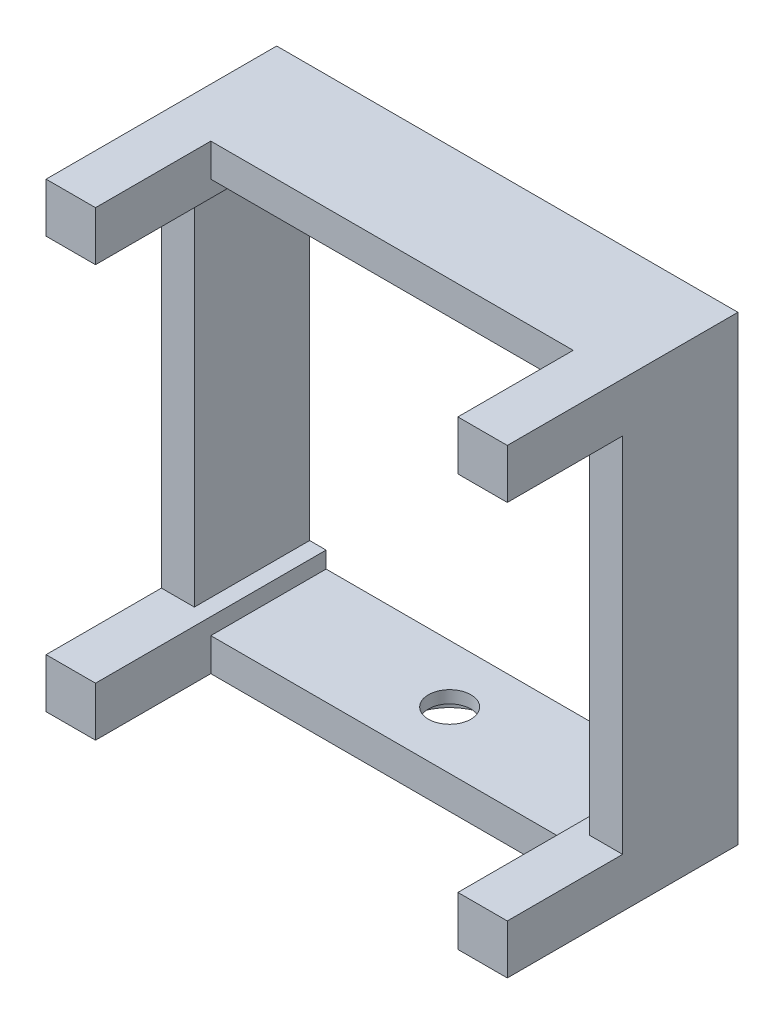
ISO-10303-21;
HEADER;
FILE_DESCRIPTION(('STEP AP214'),'2;1');
FILE_NAME('part.step','',(''),(''),'','','');
FILE_SCHEMA(('AUTOMOTIVE_DESIGN { 1 0 10303 214 1 1 1 1 }'));
ENDSEC;
DATA;
#1=APPLICATION_CONTEXT('core data for automotive mechanical design processes');
#2=APPLICATION_PROTOCOL_DEFINITION('international standard','automotive_design',2000,#1);
#3=PRODUCT_CONTEXT('',#1,'mechanical');
#4=PRODUCT('Part','Part','',(#3));
#5=PRODUCT_RELATED_PRODUCT_CATEGORY('part','',(#4));
#6=PRODUCT_DEFINITION_FORMATION('','',#4);
#7=PRODUCT_DEFINITION_CONTEXT('part definition',#1,'design');
#8=PRODUCT_DEFINITION('design','',#6,#7);
#9=PRODUCT_DEFINITION_SHAPE('','',#8);
#10=(LENGTH_UNIT() NAMED_UNIT(*) SI_UNIT(.MILLI.,.METRE.));
#11=(NAMED_UNIT(*) PLANE_ANGLE_UNIT() SI_UNIT($,.RADIAN.));
#12=(NAMED_UNIT(*) SI_UNIT($,.STERADIAN.) SOLID_ANGLE_UNIT());
#13=UNCERTAINTY_MEASURE_WITH_UNIT(LENGTH_MEASURE(1.E-05),#10,'distance_accuracy_value','');
#14=(GEOMETRIC_REPRESENTATION_CONTEXT(3) GLOBAL_UNCERTAINTY_ASSIGNED_CONTEXT((#13)) GLOBAL_UNIT_ASSIGNED_CONTEXT((#10,
#11,#12)) REPRESENTATION_CONTEXT('',''));
#15=CARTESIAN_POINT('',(0.,0.,0.));
#16=DIRECTION('',(0.,0.,1.));
#17=DIRECTION('',(1.,0.,0.));
#18=AXIS2_PLACEMENT_3D('',#15,#16,#17);
#19=CARTESIAN_POINT('',(0.,0.,0.));
#20=DIRECTION('',(0.,0.,1.));
#21=DIRECTION('',(1.,0.,0.));
#22=AXIS2_PLACEMENT_3D('',#19,#20,#21);
#23=PLANE('',#22);
#24=DIRECTION('',(1.,0.,0.));
#25=VECTOR('',#24,1.);
#26=CARTESIAN_POINT('',(0.,76.5,0.));
#27=LINE('',#26,#25);
#28=CARTESIAN_POINT('',(80.5,76.5,0.));
#29=VERTEX_POINT('',#28);
#30=CARTESIAN_POINT('',(88.5,76.5,0.));
#31=VERTEX_POINT('',#30);
#32=EDGE_CURVE('E11',#29,#31,#27,.T.);
#33=ORIENTED_EDGE('',*,*,#32,.F.);
#34=DIRECTION('',(0.,1.,0.));
#35=VECTOR('',#34,1.);
#36=CARTESIAN_POINT('',(80.5,0.,0.));
#37=LINE('',#36,#35);
#38=CARTESIAN_POINT('',(80.5,-11.5,0.));
#39=VERTEX_POINT('',#38);
#40=EDGE_CURVE('E345',#39,#29,#37,.T.);
#41=ORIENTED_EDGE('',*,*,#40,.F.);
#42=DIRECTION('',(-1.,0.,0.));
#43=VECTOR('',#42,1.);
#44=CARTESIAN_POINT('',(0.,-11.5,0.));
#45=LINE('',#44,#43);
#46=CARTESIAN_POINT('',(88.5,-11.5,0.));
#47=VERTEX_POINT('',#46);
#48=EDGE_CURVE('E393',#47,#39,#45,.T.);
#49=ORIENTED_EDGE('',*,*,#48,.F.);
#50=DIRECTION('',(0.,1.,0.));
#51=VECTOR('',#50,1.);
#52=CARTESIAN_POINT('',(88.5,0.,0.));
#53=LINE('',#52,#51);
#54=EDGE_CURVE('E362',#47,#31,#53,.T.);
#55=ORIENTED_EDGE('',*,*,#54,.T.);
#56=EDGE_LOOP('',(#33,#41,#49,#55));
#57=FACE_BOUND('',#56,.T.);
#58=ADVANCED_FACE('F33',(#57),#23,.T.);
#59=DIRECTION('',(0.,-1.,0.));
#60=VECTOR('',#59,1.);
#61=CARTESIAN_POINT('',(76.5,0.,0.));
#62=LINE('',#61,#60);
#63=CARTESIAN_POINT('',(76.5,-15.5,0.));
#64=VERTEX_POINT('',#63);
#65=CARTESIAN_POINT('',(76.5,-23.5,0.));
#66=VERTEX_POINT('',#65);
#67=EDGE_CURVE('E396',#64,#66,#62,.T.);
#68=ORIENTED_EDGE('',*,*,#67,.F.);
#69=DIRECTION('',(1.,0.,0.));
#70=VECTOR('',#69,1.);
#71=CARTESIAN_POINT('',(0.,-15.5,0.));
#72=LINE('',#71,#70);
#73=CARTESIAN_POINT('',(-11.5,-15.5,0.));
#74=VERTEX_POINT('',#73);
#75=EDGE_CURVE('E367',#74,#64,#72,.T.);
#76=ORIENTED_EDGE('',*,*,#75,.F.);
#77=DIRECTION('',(0.,1.,0.));
#78=VECTOR('',#77,1.);
#79=CARTESIAN_POINT('',(-11.5,0.,0.));
#80=LINE('',#79,#78);
#81=CARTESIAN_POINT('',(-11.5,-23.5,0.));
#82=VERTEX_POINT('',#81);
#83=EDGE_CURVE('E387',#82,#74,#80,.T.);
#84=ORIENTED_EDGE('',*,*,#83,.F.);
#85=DIRECTION('',(1.,0.,0.));
#86=VECTOR('',#85,1.);
#87=CARTESIAN_POINT('',(0.,-23.5,0.));
#88=LINE('',#87,#86);
#89=EDGE_CURVE('E360',#82,#66,#88,.T.);
#90=ORIENTED_EDGE('',*,*,#89,.T.);
#91=EDGE_LOOP('',(#68,#76,#84,#90));
#92=FACE_BOUND('',#91,.T.);
#93=ADVANCED_FACE('F482',(#92),#23,.T.);
#94=DIRECTION('',(-1.,0.,0.));
#95=VECTOR('',#94,1.);
#96=CARTESIAN_POINT('',(0.,-11.5,0.));
#97=LINE('',#96,#95);
#98=CARTESIAN_POINT('',(-15.5,-11.5,0.));
#99=VERTEX_POINT('',#98);
#100=CARTESIAN_POINT('',(-23.5,-11.5,0.));
#101=VERTEX_POINT('',#100);
#102=EDGE_CURVE('E390',#99,#101,#97,.T.);
#103=ORIENTED_EDGE('',*,*,#102,.F.);
#104=DIRECTION('',(0.,1.,0.));
#105=VECTOR('',#104,1.);
#106=CARTESIAN_POINT('',(-15.5,0.,0.));
#107=LINE('',#106,#105);
#108=CARTESIAN_POINT('',(-15.5,76.5,0.));
#109=VERTEX_POINT('',#108);
#110=EDGE_CURVE('E369',#99,#109,#107,.T.);
#111=ORIENTED_EDGE('',*,*,#110,.T.);
#112=DIRECTION('',(1.,0.,0.));
#113=VECTOR('',#112,1.);
#114=CARTESIAN_POINT('',(0.,76.5,0.));
#115=LINE('',#114,#113);
#116=CARTESIAN_POINT('',(-23.5,76.5,0.));
#117=VERTEX_POINT('',#116);
#118=EDGE_CURVE('E376',#117,#109,#115,.T.);
#119=ORIENTED_EDGE('',*,*,#118,.F.);
#120=DIRECTION('',(0.,1.,0.));
#121=VECTOR('',#120,1.);
#122=CARTESIAN_POINT('',(-23.5,0.,0.));
#123=LINE('',#122,#121);
#124=EDGE_CURVE('E341',#101,#117,#123,.T.);
#125=ORIENTED_EDGE('',*,*,#124,.F.);
#126=EDGE_LOOP('',(#103,#111,#119,#125));
#127=FACE_BOUND('',#126,.T.);
#128=ADVANCED_FACE('F469',(#127),#23,.T.);
#129=CARTESIAN_POINT('',(32.5,-15.5,-14.));
#130=DIRECTION('',(0.,-1.,0.));
#131=DIRECTION('',(0.,0.,-1.));
#132=AXIS2_PLACEMENT_3D('',#129,#130,#131);
#133=CYLINDRICAL_SURFACE('',#132,5.155);
#134=CARTESIAN_POINT('',(32.5,-15.5,-14.));
#135=DIRECTION('',(0.,-1.,0.));
#136=DIRECTION('',(0.,0.,-1.));
#137=AXIS2_PLACEMENT_3D('',#134,#135,#136);
#138=CIRCLE('',#137,5.155);
#139=CARTESIAN_POINT('',(32.5,-15.5,-19.155));
#140=VERTEX_POINT('',#139);
#141=EDGE_CURVE('E338',#140,#140,#138,.T.);
#142=ORIENTED_EDGE('',*,*,#141,.F.);
#143=EDGE_LOOP('',(#142));
#144=FACE_BOUND('',#143,.T.);
#145=CARTESIAN_POINT('',(32.5,-18.5,-14.));
#146=DIRECTION('',(0.,-1.,0.));
#147=DIRECTION('',(0.,0.,-1.));
#148=AXIS2_PLACEMENT_3D('',#145,#146,#147);
#149=CIRCLE('',#148,5.155);
#150=CARTESIAN_POINT('',(32.5,-18.5,-19.155));
#151=VERTEX_POINT('',#150);
#152=EDGE_CURVE('E335',#151,#151,#149,.F.);
#153=ORIENTED_EDGE('',*,*,#152,.F.);
#154=EDGE_LOOP('',(#153));
#155=FACE_BOUND('',#154,.T.);
#156=ADVANCED_FACE('F515',(#144,#155),#133,.F.);
#157=CARTESIAN_POINT('',(0.,-15.5,-28.));
#158=DIRECTION('',(0.,-1.,0.));
#159=DIRECTION('',(0.,0.,-1.));
#160=AXIS2_PLACEMENT_3D('',#157,#158,#159);
#161=PLANE('',#160);
#162=ORIENTED_EDGE('',*,*,#141,.T.);
#163=EDGE_LOOP('',(#162));
#164=FACE_BOUND('',#163,.T.);
#165=ORIENTED_EDGE('',*,*,#75,.T.);
#166=DIRECTION('',(0.,0.,-1.));
#167=VECTOR('',#166,1.);
#168=CARTESIAN_POINT('',(76.5,-15.5,-28.));
#169=LINE('',#168,#167);
#170=CARTESIAN_POINT('',(76.5,-15.5,-28.));
#171=VERTEX_POINT('',#170);
#172=EDGE_CURVE('E56',#64,#171,#169,.T.);
#173=ORIENTED_EDGE('',*,*,#172,.T.);
#174=DIRECTION('',(1.,0.,0.));
#175=VECTOR('',#174,1.);
#176=CARTESIAN_POINT('',(0.,-15.5,-28.));
#177=LINE('',#176,#175);
#178=CARTESIAN_POINT('',(-11.5,-15.5,-28.));
#179=VERTEX_POINT('',#178);
#180=EDGE_CURVE('E350',#179,#171,#177,.T.);
#181=ORIENTED_EDGE('',*,*,#180,.F.);
#182=DIRECTION('',(0.,0.,1.));
#183=VECTOR('',#182,1.);
#184=CARTESIAN_POINT('',(-11.5,-15.5,-28.));
#185=LINE('',#184,#183);
#186=EDGE_CURVE('E288',#179,#74,#185,.T.);
#187=ORIENTED_EDGE('',*,*,#186,.T.);
#188=EDGE_LOOP('',(#165,#173,#181,#187));
#189=FACE_BOUND('',#188,.T.);
#190=ADVANCED_FACE('F480',(#164,#189),#161,.F.);
#191=CARTESIAN_POINT('',(80.5,0.,-28.));
#192=DIRECTION('',(1.,0.,0.));
#193=DIRECTION('',(0.,0.,-1.));
#194=AXIS2_PLACEMENT_3D('',#191,#192,#193);
#195=PLANE('',#194);
#196=ORIENTED_EDGE('',*,*,#40,.T.);
#197=DIRECTION('',(0.,0.,-1.));
#198=VECTOR('',#197,1.);
#199=CARTESIAN_POINT('',(80.5,76.5,-28.));
#200=LINE('',#199,#198);
#201=CARTESIAN_POINT('',(80.5,76.5,-28.));
#202=VERTEX_POINT('',#201);
#203=EDGE_CURVE('E240',#29,#202,#200,.T.);
#204=ORIENTED_EDGE('',*,*,#203,.T.);
#205=DIRECTION('',(0.,1.,0.));
#206=VECTOR('',#205,1.);
#207=CARTESIAN_POINT('',(80.5,0.,-28.));
#208=LINE('',#207,#206);
#209=CARTESIAN_POINT('',(80.5,-11.5,-28.));
#210=VERTEX_POINT('',#209);
#211=EDGE_CURVE('E48',#210,#202,#208,.T.);
#212=ORIENTED_EDGE('',*,*,#211,.F.);
#213=DIRECTION('',(0.,0.,1.));
#214=VECTOR('',#213,1.);
#215=CARTESIAN_POINT('',(80.5,-11.5,-28.));
#216=LINE('',#215,#214);
#217=EDGE_CURVE('E262',#210,#39,#216,.T.);
#218=ORIENTED_EDGE('',*,*,#217,.T.);
#219=EDGE_LOOP('',(#196,#204,#212,#218));
#220=FACE_BOUND('',#219,.T.);
#221=ADVANCED_FACE('F524',(#220),#195,.F.);
#222=CARTESIAN_POINT('',(0.,80.5,-28.));
#223=DIRECTION('',(0.,-1.,0.));
#224=DIRECTION('',(0.,0.,-1.));
#225=AXIS2_PLACEMENT_3D('',#222,#223,#224);
#226=PLANE('',#225);
#227=DIRECTION('',(0.,0.,-1.));
#228=VECTOR('',#227,1.);
#229=CARTESIAN_POINT('',(76.5,80.5,-28.));
#230=LINE('',#229,#228);
#231=CARTESIAN_POINT('',(76.5,80.5,0.));
#232=VERTEX_POINT('',#231);
#233=CARTESIAN_POINT('',(76.5,80.5,-28.));
#234=VERTEX_POINT('',#233);
#235=EDGE_CURVE('E235',#232,#234,#230,.T.);
#236=ORIENTED_EDGE('',*,*,#235,.F.);
#237=DIRECTION('',(1.,0.,0.));
#238=VECTOR('',#237,1.);
#239=CARTESIAN_POINT('',(0.,80.5,0.));
#240=LINE('',#239,#238);
#241=CARTESIAN_POINT('',(-11.5,80.5,0.));
#242=VERTEX_POINT('',#241);
#243=EDGE_CURVE('E371',#242,#232,#240,.T.);
#244=ORIENTED_EDGE('',*,*,#243,.F.);
#245=DIRECTION('',(0.,0.,1.));
#246=VECTOR('',#245,1.);
#247=CARTESIAN_POINT('',(-11.5,80.5,-28.));
#248=LINE('',#247,#246);
#249=CARTESIAN_POINT('',(-11.5,80.5,-28.));
#250=VERTEX_POINT('',#249);
#251=EDGE_CURVE('E322',#250,#242,#248,.T.);
#252=ORIENTED_EDGE('',*,*,#251,.F.);
#253=DIRECTION('',(1.,0.,0.));
#254=VECTOR('',#253,1.);
#255=CARTESIAN_POINT('',(0.,80.5,-28.));
#256=LINE('',#255,#254);
#257=EDGE_CURVE('E354',#250,#234,#256,.T.);
#258=ORIENTED_EDGE('',*,*,#257,.T.);
#259=EDGE_LOOP('',(#236,#244,#252,#258));
#260=FACE_BOUND('',#259,.T.);
#261=CARTESIAN_POINT('',(32.5,80.5,-14.));
#262=DIRECTION('',(0.,-1.,0.));
#263=DIRECTION('',(0.,0.,-1.));
#264=AXIS2_PLACEMENT_3D('',#261,#262,#263);
#265=CIRCLE('',#264,6.5);
#266=CARTESIAN_POINT('',(32.5,80.5,-20.5));
#267=VERTEX_POINT('',#266);
#268=EDGE_CURVE('E325',#267,#267,#265,.T.);
#269=ORIENTED_EDGE('',*,*,#268,.F.);
#270=EDGE_LOOP('',(#269));
#271=FACE_BOUND('',#270,.T.);
#272=ADVANCED_FACE('F406',(#260,#271),#226,.T.);
#273=CARTESIAN_POINT('',(-23.5,0.,-28.));
#274=DIRECTION('',(1.,0.,0.));
#275=DIRECTION('',(0.,0.,-1.));
#276=AXIS2_PLACEMENT_3D('',#273,#274,#275);
#277=PLANE('',#276);
#278=DIRECTION('',(0.,0.,1.));
#279=VECTOR('',#278,1.);
#280=CARTESIAN_POINT('',(-23.5,88.5,-28.));
#281=LINE('',#280,#279);
#282=CARTESIAN_POINT('',(-23.5,88.5,-28.));
#283=VERTEX_POINT('',#282);
#284=CARTESIAN_POINT('',(-23.5,88.5,28.));
#285=VERTEX_POINT('',#284);
#286=EDGE_CURVE('E208',#283,#285,#281,.T.);
#287=ORIENTED_EDGE('',*,*,#286,.F.);
#288=DIRECTION('',(0.,1.,0.));
#289=VECTOR('',#288,1.);
#290=CARTESIAN_POINT('',(-23.5,0.,-28.));
#291=LINE('',#290,#289);
#292=CARTESIAN_POINT('',(-23.5,-23.5,-28.));
#293=VERTEX_POINT('',#292);
#294=EDGE_CURVE('E342',#293,#283,#291,.T.);
#295=ORIENTED_EDGE('',*,*,#294,.F.);
#296=DIRECTION('',(0.,0.,1.));
#297=VECTOR('',#296,1.);
#298=CARTESIAN_POINT('',(-23.5,-23.5,-28.));
#299=LINE('',#298,#297);
#300=CARTESIAN_POINT('',(-23.5,-23.5,28.));
#301=VERTEX_POINT('',#300);
#302=EDGE_CURVE('E358',#293,#301,#299,.T.);
#303=ORIENTED_EDGE('',*,*,#302,.T.);
#304=DIRECTION('',(0.,-1.,0.));
#305=VECTOR('',#304,1.);
#306=CARTESIAN_POINT('',(-23.5,-23.5,28.));
#307=LINE('',#306,#305);
#308=CARTESIAN_POINT('',(-23.5,-11.5,28.));
#309=VERTEX_POINT('',#308);
#310=EDGE_CURVE('E268',#309,#301,#307,.T.);
#311=ORIENTED_EDGE('',*,*,#310,.F.);
#312=DIRECTION('',(0.,0.,1.));
#313=VECTOR('',#312,1.);
#314=CARTESIAN_POINT('',(-23.5,-11.5,-28.));
#315=LINE('',#314,#313);
#316=EDGE_CURVE('E286',#101,#309,#315,.T.);
#317=ORIENTED_EDGE('',*,*,#316,.F.);
#318=ORIENTED_EDGE('',*,*,#124,.T.);
#319=DIRECTION('',(0.,0.,1.));
#320=VECTOR('',#319,1.);
#321=CARTESIAN_POINT('',(-23.5,76.5,-28.));
#322=LINE('',#321,#320);
#323=CARTESIAN_POINT('',(-23.5,76.5,28.));
#324=VERTEX_POINT('',#323);
#325=EDGE_CURVE('E313',#117,#324,#322,.T.);
#326=ORIENTED_EDGE('',*,*,#325,.T.);
#327=DIRECTION('',(0.,-1.,0.));
#328=VECTOR('',#327,1.);
#329=CARTESIAN_POINT('',(-23.5,88.5,28.));
#330=LINE('',#329,#328);
#331=EDGE_CURVE('E296',#285,#324,#330,.T.);
#332=ORIENTED_EDGE('',*,*,#331,.F.);
#333=EDGE_LOOP('',(#287,#295,#303,#311,#317,#318,#326,#332));
#334=FACE_BOUND('',#333,.T.);
#335=ADVANCED_FACE('F35',(#334),#277,.F.);
#336=CARTESIAN_POINT('',(0.,88.5,-28.));
#337=DIRECTION('',(0.,-1.,0.));
#338=DIRECTION('',(0.,0.,-1.));
#339=AXIS2_PLACEMENT_3D('',#336,#337,#338);
#340=PLANE('',#339);
#341=DIRECTION('',(1.,0.,0.));
#342=VECTOR('',#341,1.);
#343=CARTESIAN_POINT('',(0.,88.5,0.));
#344=LINE('',#343,#342);
#345=CARTESIAN_POINT('',(-11.5,88.5,0.));
#346=VERTEX_POINT('',#345);
#347=CARTESIAN_POINT('',(76.5,88.5,0.));
#348=VERTEX_POINT('',#347);
#349=EDGE_CURVE('E365',#346,#348,#344,.T.);
#350=ORIENTED_EDGE('',*,*,#349,.T.);
#351=DIRECTION('',(0.,0.,1.));
#352=VECTOR('',#351,1.);
#353=CARTESIAN_POINT('',(76.5,88.5,-28.));
#354=LINE('',#353,#352);
#355=CARTESIAN_POINT('',(76.5,88.5,28.));
#356=VERTEX_POINT('',#355);
#357=EDGE_CURVE('E215',#348,#356,#354,.T.);
#358=ORIENTED_EDGE('',*,*,#357,.T.);
#359=DIRECTION('',(-1.,0.,0.));
#360=VECTOR('',#359,1.);
#361=CARTESIAN_POINT('',(88.5,88.5,28.));
#362=LINE('',#361,#360);
#363=CARTESIAN_POINT('',(88.5,88.5,28.));
#364=VERTEX_POINT('',#363);
#365=EDGE_CURVE('E212',#364,#356,#362,.T.);
#366=ORIENTED_EDGE('',*,*,#365,.F.);
#367=DIRECTION('',(0.,0.,1.));
#368=VECTOR('',#367,1.);
#369=CARTESIAN_POINT('',(88.5,88.5,-28.));
#370=LINE('',#369,#368);
#371=CARTESIAN_POINT('',(88.5,88.5,-28.));
#372=VERTEX_POINT('',#371);
#373=EDGE_CURVE('E196',#372,#364,#370,.T.);
#374=ORIENTED_EDGE('',*,*,#373,.F.);
#375=DIRECTION('',(1.,0.,0.));
#376=VECTOR('',#375,1.);
#377=CARTESIAN_POINT('',(0.,88.5,-28.));
#378=LINE('',#377,#376);
#379=EDGE_CURVE('E348',#283,#372,#378,.T.);
#380=ORIENTED_EDGE('',*,*,#379,.F.);
#381=ORIENTED_EDGE('',*,*,#286,.T.);
#382=DIRECTION('',(-1.,0.,0.));
#383=VECTOR('',#382,1.);
#384=CARTESIAN_POINT('',(-23.5,88.5,28.));
#385=LINE('',#384,#383);
#386=CARTESIAN_POINT('',(-11.5,88.5,28.));
#387=VERTEX_POINT('',#386);
#388=EDGE_CURVE('E305',#387,#285,#385,.T.);
#389=ORIENTED_EDGE('',*,*,#388,.F.);
#390=DIRECTION('',(0.,0.,1.));
#391=VECTOR('',#390,1.);
#392=CARTESIAN_POINT('',(-11.5,88.5,-28.));
#393=LINE('',#392,#391);
#394=EDGE_CURVE('E314',#346,#387,#393,.T.);
#395=ORIENTED_EDGE('',*,*,#394,.F.);
#396=EDGE_LOOP('',(#350,#358,#366,#374,#380,#381,#389,#395));
#397=FACE_BOUND('',#396,.T.);
#398=ADVANCED_FACE('F214',(#397),#340,.F.);
#399=CARTESIAN_POINT('',(88.5,0.,-28.));
#400=DIRECTION('',(1.,0.,0.));
#401=DIRECTION('',(0.,0.,-1.));
#402=AXIS2_PLACEMENT_3D('',#399,#400,#401);
#403=PLANE('',#402);
#404=DIRECTION('',(0.,1.,0.));
#405=VECTOR('',#404,1.);
#406=CARTESIAN_POINT('',(88.5,0.,-28.));
#407=LINE('',#406,#405);
#408=CARTESIAN_POINT('',(88.5,-23.5,-28.));
#409=VERTEX_POINT('',#408);
#410=EDGE_CURVE('E204',#409,#372,#407,.T.);
#411=ORIENTED_EDGE('',*,*,#410,.T.);
#412=ORIENTED_EDGE('',*,*,#373,.T.);
#413=DIRECTION('',(0.,1.,0.));
#414=VECTOR('',#413,1.);
#415=CARTESIAN_POINT('',(88.5,88.5,28.));
#416=LINE('',#415,#414);
#417=CARTESIAN_POINT('',(88.5,76.5,28.));
#418=VERTEX_POINT('',#417);
#419=EDGE_CURVE('E201',#418,#364,#416,.T.);
#420=ORIENTED_EDGE('',*,*,#419,.F.);
#421=DIRECTION('',(0.,0.,1.));
#422=VECTOR('',#421,1.);
#423=CARTESIAN_POINT('',(88.5,76.5,-28.));
#424=LINE('',#423,#422);
#425=EDGE_CURVE('E233',#31,#418,#424,.T.);
#426=ORIENTED_EDGE('',*,*,#425,.F.);
#427=ORIENTED_EDGE('',*,*,#54,.F.);
#428=DIRECTION('',(0.,0.,1.));
#429=VECTOR('',#428,1.);
#430=CARTESIAN_POINT('',(88.5,-11.5,-28.));
#431=LINE('',#430,#429);
#432=CARTESIAN_POINT('',(88.5,-11.5,28.));
#433=VERTEX_POINT('',#432);
#434=EDGE_CURVE('E259',#47,#433,#431,.T.);
#435=ORIENTED_EDGE('',*,*,#434,.T.);
#436=DIRECTION('',(0.,1.,0.));
#437=VECTOR('',#436,1.);
#438=CARTESIAN_POINT('',(88.5,-23.5,28.));
#439=LINE('',#438,#437);
#440=CARTESIAN_POINT('',(88.5,-23.5,28.));
#441=VERTEX_POINT('',#440);
#442=EDGE_CURVE('E242',#441,#433,#439,.T.);
#443=ORIENTED_EDGE('',*,*,#442,.F.);
#444=DIRECTION('',(0.,0.,1.));
#445=VECTOR('',#444,1.);
#446=CARTESIAN_POINT('',(88.5,-23.5,-28.));
#447=LINE('',#446,#445);
#448=EDGE_CURVE('E209',#409,#441,#447,.T.);
#449=ORIENTED_EDGE('',*,*,#448,.F.);
#450=EDGE_LOOP('',(#411,#412,#420,#426,#427,#435,#443,#449));
#451=FACE_BOUND('',#450,.T.);
#452=ADVANCED_FACE('F198',(#451),#403,.T.);
#453=CARTESIAN_POINT('',(0.,-23.5,-28.));
#454=DIRECTION('',(0.,-1.,0.));
#455=DIRECTION('',(0.,0.,-1.));
#456=AXIS2_PLACEMENT_3D('',#453,#454,#455);
#457=PLANE('',#456);
#458=DIRECTION('',(1.,0.,0.));
#459=VECTOR('',#458,1.);
#460=CARTESIAN_POINT('',(0.,-23.5,-28.));
#461=LINE('',#460,#459);
#462=EDGE_CURVE('E344',#293,#409,#461,.T.);
#463=ORIENTED_EDGE('',*,*,#462,.T.);
#464=ORIENTED_EDGE('',*,*,#448,.T.);
#465=DIRECTION('',(1.,0.,0.));
#466=VECTOR('',#465,1.);
#467=CARTESIAN_POINT('',(88.5,-23.5,28.));
#468=LINE('',#467,#466);
#469=CARTESIAN_POINT('',(76.5,-23.5,28.));
#470=VERTEX_POINT('',#469);
#471=EDGE_CURVE('E251',#470,#441,#468,.T.);
#472=ORIENTED_EDGE('',*,*,#471,.F.);
#473=DIRECTION('',(0.,0.,1.));
#474=VECTOR('',#473,1.);
#475=CARTESIAN_POINT('',(76.5,-23.5,-28.));
#476=LINE('',#475,#474);
#477=EDGE_CURVE('E260',#66,#470,#476,.T.);
#478=ORIENTED_EDGE('',*,*,#477,.F.);
#479=ORIENTED_EDGE('',*,*,#89,.F.);
#480=DIRECTION('',(0.,0.,1.));
#481=VECTOR('',#480,1.);
#482=CARTESIAN_POINT('',(-11.5,-23.5,-28.));
#483=LINE('',#482,#481);
#484=CARTESIAN_POINT('',(-11.5,-23.5,28.));
#485=VERTEX_POINT('',#484);
#486=EDGE_CURVE('E285',#82,#485,#483,.T.);
#487=ORIENTED_EDGE('',*,*,#486,.T.);
#488=DIRECTION('',(1.,0.,0.));
#489=VECTOR('',#488,1.);
#490=CARTESIAN_POINT('',(-23.5,-23.5,28.));
#491=LINE('',#490,#489);
#492=EDGE_CURVE('E271',#301,#485,#491,.T.);
#493=ORIENTED_EDGE('',*,*,#492,.F.);
#494=ORIENTED_EDGE('',*,*,#302,.F.);
#495=EDGE_LOOP('',(#463,#464,#472,#478,#479,#487,#493,#494));
#496=FACE_BOUND('',#495,.T.);
#497=CARTESIAN_POINT('',(32.5,-23.5,-14.));
#498=DIRECTION('',(0.,-1.,0.));
#499=DIRECTION('',(0.,0.,-1.));
#500=AXIS2_PLACEMENT_3D('',#497,#498,#499);
#501=CIRCLE('',#500,11.115);
#502=CARTESIAN_POINT('',(32.5,-23.5,-25.115));
#503=VERTEX_POINT('',#502);
#504=EDGE_CURVE('E329',#503,#503,#501,.T.);
#505=ORIENTED_EDGE('',*,*,#504,.F.);
#506=EDGE_LOOP('',(#505));
#507=FACE_BOUND('',#506,.T.);
#508=ADVANCED_FACE('F452',(#496,#507),#457,.T.);
#509=CARTESIAN_POINT('',(-15.5,0.,-28.));
#510=DIRECTION('',(1.,0.,0.));
#511=DIRECTION('',(0.,0.,-1.));
#512=AXIS2_PLACEMENT_3D('',#509,#510,#511);
#513=PLANE('',#512);
#514=DIRECTION('',(0.,0.,1.));
#515=VECTOR('',#514,1.);
#516=CARTESIAN_POINT('',(-15.5,-11.5,-28.));
#517=LINE('',#516,#515);
#518=CARTESIAN_POINT('',(-15.5,-11.5,-28.));
#519=VERTEX_POINT('',#518);
#520=EDGE_CURVE('E293',#519,#99,#517,.T.);
#521=ORIENTED_EDGE('',*,*,#520,.F.);
#522=DIRECTION('',(0.,1.,0.));
#523=VECTOR('',#522,1.);
#524=CARTESIAN_POINT('',(-15.5,0.,-28.));
#525=LINE('',#524,#523);
#526=CARTESIAN_POINT('',(-15.5,76.5,-28.));
#527=VERTEX_POINT('',#526);
#528=EDGE_CURVE('E352',#519,#527,#525,.T.);
#529=ORIENTED_EDGE('',*,*,#528,.T.);
#530=DIRECTION('',(0.,0.,-1.));
#531=VECTOR('',#530,1.);
#532=CARTESIAN_POINT('',(-15.5,76.5,-28.));
#533=LINE('',#532,#531);
#534=EDGE_CURVE('E316',#109,#527,#533,.T.);
#535=ORIENTED_EDGE('',*,*,#534,.F.);
#536=ORIENTED_EDGE('',*,*,#110,.F.);
#537=EDGE_LOOP('',(#521,#529,#535,#536));
#538=FACE_BOUND('',#537,.T.);
#539=ADVANCED_FACE('F472',(#538),#513,.T.);
#540=CARTESIAN_POINT('',(0.,0.,-28.));
#541=DIRECTION('',(0.,0.,1.));
#542=DIRECTION('',(1.,0.,0.));
#543=AXIS2_PLACEMENT_3D('',#540,#541,#542);
#544=PLANE('',#543);
#545=ORIENTED_EDGE('',*,*,#379,.T.);
#546=ORIENTED_EDGE('',*,*,#410,.F.);
#547=ORIENTED_EDGE('',*,*,#462,.F.);
#548=ORIENTED_EDGE('',*,*,#294,.T.);
#549=EDGE_LOOP('',(#545,#546,#547,#548));
#550=FACE_BOUND('',#549,.T.);
#551=ORIENTED_EDGE('',*,*,#211,.T.);
#552=DIRECTION('',(1.,0.,0.));
#553=VECTOR('',#552,1.);
#554=CARTESIAN_POINT('',(88.5,76.5,-28.));
#555=LINE('',#554,#553);
#556=CARTESIAN_POINT('',(76.5,76.5,-28.));
#557=VERTEX_POINT('',#556);
#558=EDGE_CURVE('E231',#557,#202,#555,.T.);
#559=ORIENTED_EDGE('',*,*,#558,.F.);
#560=DIRECTION('',(0.,-1.,0.));
#561=VECTOR('',#560,1.);
#562=CARTESIAN_POINT('',(76.5,88.5,-28.));
#563=LINE('',#562,#561);
#564=EDGE_CURVE('E229',#234,#557,#563,.T.);
#565=ORIENTED_EDGE('',*,*,#564,.F.);
#566=ORIENTED_EDGE('',*,*,#257,.F.);
#567=DIRECTION('',(0.,1.,0.));
#568=VECTOR('',#567,1.);
#569=CARTESIAN_POINT('',(-11.5,88.5,-28.));
#570=LINE('',#569,#568);
#571=CARTESIAN_POINT('',(-11.5,76.5,-28.));
#572=VERTEX_POINT('',#571);
#573=EDGE_CURVE('E310',#572,#250,#570,.T.);
#574=ORIENTED_EDGE('',*,*,#573,.F.);
#575=DIRECTION('',(1.,0.,0.));
#576=VECTOR('',#575,1.);
#577=CARTESIAN_POINT('',(-23.5,76.5,-28.));
#578=LINE('',#577,#576);
#579=EDGE_CURVE('E308',#527,#572,#578,.T.);
#580=ORIENTED_EDGE('',*,*,#579,.F.);
#581=ORIENTED_EDGE('',*,*,#528,.F.);
#582=DIRECTION('',(-1.,0.,0.));
#583=VECTOR('',#582,1.);
#584=CARTESIAN_POINT('',(-23.5,-11.5,-28.));
#585=LINE('',#584,#583);
#586=CARTESIAN_POINT('',(-11.5,-11.5,-28.));
#587=VERTEX_POINT('',#586);
#588=EDGE_CURVE('E282',#587,#519,#585,.T.);
#589=ORIENTED_EDGE('',*,*,#588,.F.);
#590=DIRECTION('',(0.,1.,0.));
#591=VECTOR('',#590,1.);
#592=CARTESIAN_POINT('',(-11.5,-23.5,-28.));
#593=LINE('',#592,#591);
#594=EDGE_CURVE('E280',#179,#587,#593,.T.);
#595=ORIENTED_EDGE('',*,*,#594,.F.);
#596=ORIENTED_EDGE('',*,*,#180,.T.);
#597=DIRECTION('',(0.,-1.,0.));
#598=VECTOR('',#597,1.);
#599=CARTESIAN_POINT('',(76.5,-23.5,-28.));
#600=LINE('',#599,#598);
#601=CARTESIAN_POINT('',(76.5,-11.5,-28.));
#602=VERTEX_POINT('',#601);
#603=EDGE_CURVE('E256',#602,#171,#600,.T.);
#604=ORIENTED_EDGE('',*,*,#603,.F.);
#605=DIRECTION('',(-1.,0.,0.));
#606=VECTOR('',#605,1.);
#607=CARTESIAN_POINT('',(88.5,-11.5,-28.));
#608=LINE('',#607,#606);
#609=EDGE_CURVE('E254',#210,#602,#608,.T.);
#610=ORIENTED_EDGE('',*,*,#609,.F.);
#611=EDGE_LOOP('',(#551,#559,#565,#566,#574,#580,#581,#589,#595,#596,#604,#610));
#612=FACE_BOUND('',#611,.T.);
#613=ADVANCED_FACE('F431',(#550,#612),#544,.F.);
#614=DIRECTION('',(0.,-1.,0.));
#615=VECTOR('',#614,1.);
#616=CARTESIAN_POINT('',(76.5,0.,0.));
#617=LINE('',#616,#615);
#618=EDGE_CURVE('E41',#348,#232,#617,.T.);
#619=ORIENTED_EDGE('',*,*,#618,.F.);
#620=ORIENTED_EDGE('',*,*,#349,.F.);
#621=DIRECTION('',(0.,1.,0.));
#622=VECTOR('',#621,1.);
#623=CARTESIAN_POINT('',(-11.5,0.,0.));
#624=LINE('',#623,#622);
#625=EDGE_CURVE('E384',#242,#346,#624,.T.);
#626=ORIENTED_EDGE('',*,*,#625,.F.);
#627=ORIENTED_EDGE('',*,*,#243,.T.);
#628=EDGE_LOOP('',(#619,#620,#626,#627));
#629=FACE_BOUND('',#628,.T.);
#630=ADVANCED_FACE('F409',(#629),#23,.T.);
#631=CARTESIAN_POINT('',(32.5,-18.5,-14.));
#632=DIRECTION('',(0.,-1.,0.));
#633=DIRECTION('',(0.,0.,-1.));
#634=AXIS2_PLACEMENT_3D('',#631,#632,#633);
#635=PLANE('',#634);
#636=CARTESIAN_POINT('',(32.5,-18.5,-14.));
#637=DIRECTION('',(0.,-1.,0.));
#638=DIRECTION('',(0.,0.,-1.));
#639=AXIS2_PLACEMENT_3D('',#636,#637,#638);
#640=CIRCLE('',#639,11.115);
#641=CARTESIAN_POINT('',(32.5,-18.5,-25.115));
#642=VERTEX_POINT('',#641);
#643=EDGE_CURVE('E332',#642,#642,#640,.T.);
#644=ORIENTED_EDGE('',*,*,#643,.T.);
#645=EDGE_LOOP('',(#644));
#646=FACE_BOUND('',#645,.T.);
#647=ORIENTED_EDGE('',*,*,#152,.T.);
#648=EDGE_LOOP('',(#647));
#649=FACE_BOUND('',#648,.T.);
#650=ADVANCED_FACE('F504',(#646,#649),#635,.T.);
#651=CARTESIAN_POINT('',(32.5,-18.5,-14.));
#652=DIRECTION('',(0.,-1.,0.));
#653=DIRECTION('',(0.,0.,-1.));
#654=AXIS2_PLACEMENT_3D('',#651,#652,#653);
#655=CYLINDRICAL_SURFACE('',#654,11.115);
#656=ORIENTED_EDGE('',*,*,#643,.F.);
#657=EDGE_LOOP('',(#656));
#658=FACE_BOUND('',#657,.T.);
#659=ORIENTED_EDGE('',*,*,#504,.T.);
#660=EDGE_LOOP('',(#659));
#661=FACE_BOUND('',#660,.T.);
#662=ADVANCED_FACE('F510',(#658,#661),#655,.F.);
#663=CARTESIAN_POINT('',(32.5,85.5,-14.));
#664=DIRECTION('',(0.,-1.,0.));
#665=DIRECTION('',(0.,0.,-1.));
#666=AXIS2_PLACEMENT_3D('',#663,#664,#665);
#667=CYLINDRICAL_SURFACE('',#666,6.5);
#668=CARTESIAN_POINT('',(32.5,85.5,-14.));
#669=DIRECTION('',(0.,-1.,0.));
#670=DIRECTION('',(0.,0.,-1.));
#671=AXIS2_PLACEMENT_3D('',#668,#669,#670);
#672=CIRCLE('',#671,6.5);
#673=CARTESIAN_POINT('',(32.5,85.5,-20.5));
#674=VERTEX_POINT('',#673);
#675=EDGE_CURVE('E326',#674,#674,#672,.T.);
#676=ORIENTED_EDGE('',*,*,#675,.F.);
#677=EDGE_LOOP('',(#676));
#678=FACE_BOUND('',#677,.T.);
#679=ORIENTED_EDGE('',*,*,#268,.T.);
#680=EDGE_LOOP('',(#679));
#681=FACE_BOUND('',#680,.T.);
#682=ADVANCED_FACE('F531',(#678,#681),#667,.F.);
#683=CARTESIAN_POINT('',(32.5,85.5,-14.));
#684=DIRECTION('',(0.,-1.,0.));
#685=DIRECTION('',(0.,0.,-1.));
#686=AXIS2_PLACEMENT_3D('',#683,#684,#685);
#687=PLANE('',#686);
#688=ORIENTED_EDGE('',*,*,#675,.T.);
#689=EDGE_LOOP('',(#688));
#690=FACE_BOUND('',#689,.T.);
#691=ADVANCED_FACE('F536',(#690),#687,.T.);
#692=CARTESIAN_POINT('',(-11.5,88.5,-28.));
#693=DIRECTION('',(1.,0.,0.));
#694=DIRECTION('',(0.,1.,0.));
#695=AXIS2_PLACEMENT_3D('',#692,#693,#694);
#696=PLANE('',#695);
#697=ORIENTED_EDGE('',*,*,#573,.T.);
#698=ORIENTED_EDGE('',*,*,#251,.T.);
#699=ORIENTED_EDGE('',*,*,#625,.T.);
#700=ORIENTED_EDGE('',*,*,#394,.T.);
#701=DIRECTION('',(0.,1.,0.));
#702=VECTOR('',#701,1.);
#703=CARTESIAN_POINT('',(-11.5,88.5,28.));
#704=LINE('',#703,#702);
#705=CARTESIAN_POINT('',(-11.5,76.5,28.));
#706=VERTEX_POINT('',#705);
#707=EDGE_CURVE('E302',#706,#387,#704,.T.);
#708=ORIENTED_EDGE('',*,*,#707,.F.);
#709=DIRECTION('',(0.,0.,1.));
#710=VECTOR('',#709,1.);
#711=CARTESIAN_POINT('',(-11.5,76.5,-28.));
#712=LINE('',#711,#710);
#713=EDGE_CURVE('E317',#572,#706,#712,.T.);
#714=ORIENTED_EDGE('',*,*,#713,.F.);
#715=EDGE_LOOP('',(#697,#698,#699,#700,#708,#714));
#716=FACE_BOUND('',#715,.T.);
#717=ADVANCED_FACE('F412',(#716),#696,.T.);
#718=CARTESIAN_POINT('',(-23.5,76.5,-28.));
#719=DIRECTION('',(0.,-1.,0.));
#720=DIRECTION('',(0.,0.,-1.));
#721=AXIS2_PLACEMENT_3D('',#718,#719,#720);
#722=PLANE('',#721);
#723=ORIENTED_EDGE('',*,*,#118,.T.);
#724=ORIENTED_EDGE('',*,*,#534,.T.);
#725=ORIENTED_EDGE('',*,*,#579,.T.);
#726=ORIENTED_EDGE('',*,*,#713,.T.);
#727=DIRECTION('',(1.,0.,0.));
#728=VECTOR('',#727,1.);
#729=CARTESIAN_POINT('',(-23.5,76.5,28.));
#730=LINE('',#729,#728);
#731=EDGE_CURVE('E299',#324,#706,#730,.T.);
#732=ORIENTED_EDGE('',*,*,#731,.F.);
#733=ORIENTED_EDGE('',*,*,#325,.F.);
#734=EDGE_LOOP('',(#723,#724,#725,#726,#732,#733));
#735=FACE_BOUND('',#734,.T.);
#736=ADVANCED_FACE('F426',(#735),#722,.T.);
#737=CARTESIAN_POINT('',(0.,0.,28.));
#738=DIRECTION('',(0.,0.,1.));
#739=DIRECTION('',(1.,0.,0.));
#740=AXIS2_PLACEMENT_3D('',#737,#738,#739);
#741=PLANE('',#740);
#742=ORIENTED_EDGE('',*,*,#331,.T.);
#743=ORIENTED_EDGE('',*,*,#731,.T.);
#744=ORIENTED_EDGE('',*,*,#707,.T.);
#745=ORIENTED_EDGE('',*,*,#388,.T.);
#746=EDGE_LOOP('',(#742,#743,#744,#745));
#747=FACE_BOUND('',#746,.T.);
#748=ADVANCED_FACE('F418',(#747),#741,.T.);
#749=CARTESIAN_POINT('',(-11.5,-23.5,-28.));
#750=DIRECTION('',(1.,0.,0.));
#751=DIRECTION('',(0.,0.,-1.));
#752=AXIS2_PLACEMENT_3D('',#749,#750,#751);
#753=PLANE('',#752);
#754=ORIENTED_EDGE('',*,*,#186,.F.);
#755=ORIENTED_EDGE('',*,*,#594,.T.);
#756=DIRECTION('',(0.,0.,1.));
#757=VECTOR('',#756,1.);
#758=CARTESIAN_POINT('',(-11.5,-11.5,-28.));
#759=LINE('',#758,#757);
#760=CARTESIAN_POINT('',(-11.5,-11.5,28.));
#761=VERTEX_POINT('',#760);
#762=EDGE_CURVE('E289',#587,#761,#759,.T.);
#763=ORIENTED_EDGE('',*,*,#762,.T.);
#764=DIRECTION('',(0.,1.,0.));
#765=VECTOR('',#764,1.);
#766=CARTESIAN_POINT('',(-11.5,-23.5,28.));
#767=LINE('',#766,#765);
#768=EDGE_CURVE('E274',#485,#761,#767,.T.);
#769=ORIENTED_EDGE('',*,*,#768,.F.);
#770=ORIENTED_EDGE('',*,*,#486,.F.);
#771=ORIENTED_EDGE('',*,*,#83,.T.);
#772=EDGE_LOOP('',(#754,#755,#763,#769,#770,#771));
#773=FACE_BOUND('',#772,.T.);
#774=ADVANCED_FACE('F477',(#773),#753,.T.);
#775=CARTESIAN_POINT('',(-23.5,-11.5,-28.));
#776=DIRECTION('',(0.,1.,0.));
#777=DIRECTION('',(0.,0.,1.));
#778=AXIS2_PLACEMENT_3D('',#775,#776,#777);
#779=PLANE('',#778);
#780=ORIENTED_EDGE('',*,*,#588,.T.);
#781=ORIENTED_EDGE('',*,*,#520,.T.);
#782=ORIENTED_EDGE('',*,*,#102,.T.);
#783=ORIENTED_EDGE('',*,*,#316,.T.);
#784=DIRECTION('',(-1.,0.,0.));
#785=VECTOR('',#784,1.);
#786=CARTESIAN_POINT('',(-23.5,-11.5,28.));
#787=LINE('',#786,#785);
#788=EDGE_CURVE('E277',#761,#309,#787,.T.);
#789=ORIENTED_EDGE('',*,*,#788,.F.);
#790=ORIENTED_EDGE('',*,*,#762,.F.);
#791=EDGE_LOOP('',(#780,#781,#782,#783,#789,#790));
#792=FACE_BOUND('',#791,.T.);
#793=ADVANCED_FACE('F465',(#792),#779,.T.);
#794=CARTESIAN_POINT('',(0.,0.,28.));
#795=DIRECTION('',(0.,0.,-1.));
#796=DIRECTION('',(-1.,0.,0.));
#797=AXIS2_PLACEMENT_3D('',#794,#795,#796);
#798=PLANE('',#797);
#799=ORIENTED_EDGE('',*,*,#310,.T.);
#800=ORIENTED_EDGE('',*,*,#492,.T.);
#801=ORIENTED_EDGE('',*,*,#768,.T.);
#802=ORIENTED_EDGE('',*,*,#788,.T.);
#803=EDGE_LOOP('',(#799,#800,#801,#802));
#804=FACE_BOUND('',#803,.T.);
#805=ADVANCED_FACE('F461',(#804),#798,.F.);
#806=CARTESIAN_POINT('',(76.5,-23.5,-28.));
#807=DIRECTION('',(-1.,0.,0.));
#808=DIRECTION('',(0.,0.,1.));
#809=AXIS2_PLACEMENT_3D('',#806,#807,#808);
#810=PLANE('',#809);
#811=ORIENTED_EDGE('',*,*,#172,.F.);
#812=ORIENTED_EDGE('',*,*,#67,.T.);
#813=ORIENTED_EDGE('',*,*,#477,.T.);
#814=DIRECTION('',(0.,-1.,0.));
#815=VECTOR('',#814,1.);
#816=CARTESIAN_POINT('',(76.5,-23.5,28.));
#817=LINE('',#816,#815);
#818=CARTESIAN_POINT('',(76.5,-11.5,28.));
#819=VERTEX_POINT('',#818);
#820=EDGE_CURVE('E248',#819,#470,#817,.T.);
#821=ORIENTED_EDGE('',*,*,#820,.F.);
#822=DIRECTION('',(0.,0.,1.));
#823=VECTOR('',#822,1.);
#824=CARTESIAN_POINT('',(76.5,-11.5,-28.));
#825=LINE('',#824,#823);
#826=EDGE_CURVE('E263',#602,#819,#825,.T.);
#827=ORIENTED_EDGE('',*,*,#826,.F.);
#828=ORIENTED_EDGE('',*,*,#603,.T.);
#829=EDGE_LOOP('',(#811,#812,#813,#821,#827,#828));
#830=FACE_BOUND('',#829,.T.);
#831=ADVANCED_FACE('F484',(#830),#810,.T.);
#832=CARTESIAN_POINT('',(88.5,-11.5,-28.));
#833=DIRECTION('',(0.,1.,0.));
#834=DIRECTION('',(-1.,0.,0.));
#835=AXIS2_PLACEMENT_3D('',#832,#833,#834);
#836=PLANE('',#835);
#837=ORIENTED_EDGE('',*,*,#217,.F.);
#838=ORIENTED_EDGE('',*,*,#609,.T.);
#839=ORIENTED_EDGE('',*,*,#826,.T.);
#840=DIRECTION('',(-1.,0.,0.));
#841=VECTOR('',#840,1.);
#842=CARTESIAN_POINT('',(88.5,-11.5,28.));
#843=LINE('',#842,#841);
#844=EDGE_CURVE('E245',#433,#819,#843,.T.);
#845=ORIENTED_EDGE('',*,*,#844,.F.);
#846=ORIENTED_EDGE('',*,*,#434,.F.);
#847=ORIENTED_EDGE('',*,*,#48,.T.);
#848=EDGE_LOOP('',(#837,#838,#839,#845,#846,#847));
#849=FACE_BOUND('',#848,.T.);
#850=ADVANCED_FACE('F442',(#849),#836,.T.);
#851=CARTESIAN_POINT('',(0.,0.,28.));
#852=DIRECTION('',(0.,0.,1.));
#853=DIRECTION('',(1.,0.,0.));
#854=AXIS2_PLACEMENT_3D('',#851,#852,#853);
#855=PLANE('',#854);
#856=ORIENTED_EDGE('',*,*,#442,.T.);
#857=ORIENTED_EDGE('',*,*,#844,.T.);
#858=ORIENTED_EDGE('',*,*,#820,.T.);
#859=ORIENTED_EDGE('',*,*,#471,.T.);
#860=EDGE_LOOP('',(#856,#857,#858,#859));
#861=FACE_BOUND('',#860,.T.);
#862=ADVANCED_FACE('F447',(#861),#855,.T.);
#863=CARTESIAN_POINT('',(88.5,76.5,-28.));
#864=DIRECTION('',(0.,-1.,0.));
#865=DIRECTION('',(0.,0.,-1.));
#866=AXIS2_PLACEMENT_3D('',#863,#864,#865);
#867=PLANE('',#866);
#868=ORIENTED_EDGE('',*,*,#203,.F.);
#869=ORIENTED_EDGE('',*,*,#32,.T.);
#870=ORIENTED_EDGE('',*,*,#425,.T.);
#871=DIRECTION('',(1.,0.,0.));
#872=VECTOR('',#871,1.);
#873=CARTESIAN_POINT('',(88.5,76.5,28.));
#874=LINE('',#873,#872);
#875=CARTESIAN_POINT('',(76.5,76.5,28.));
#876=VERTEX_POINT('',#875);
#877=EDGE_CURVE('E224',#876,#418,#874,.T.);
#878=ORIENTED_EDGE('',*,*,#877,.F.);
#879=DIRECTION('',(0.,0.,1.));
#880=VECTOR('',#879,1.);
#881=CARTESIAN_POINT('',(76.5,76.5,-28.));
#882=LINE('',#881,#880);
#883=EDGE_CURVE('E236',#557,#876,#882,.T.);
#884=ORIENTED_EDGE('',*,*,#883,.F.);
#885=ORIENTED_EDGE('',*,*,#558,.T.);
#886=EDGE_LOOP('',(#868,#869,#870,#878,#884,#885));
#887=FACE_BOUND('',#886,.T.);
#888=ADVANCED_FACE('F436',(#887),#867,.T.);
#889=CARTESIAN_POINT('',(76.5,88.5,-28.));
#890=DIRECTION('',(-1.,0.,0.));
#891=DIRECTION('',(0.,0.,1.));
#892=AXIS2_PLACEMENT_3D('',#889,#890,#891);
#893=PLANE('',#892);
#894=ORIENTED_EDGE('',*,*,#618,.T.);
#895=ORIENTED_EDGE('',*,*,#235,.T.);
#896=ORIENTED_EDGE('',*,*,#564,.T.);
#897=ORIENTED_EDGE('',*,*,#883,.T.);
#898=DIRECTION('',(0.,-1.,0.));
#899=VECTOR('',#898,1.);
#900=CARTESIAN_POINT('',(76.5,88.5,28.));
#901=LINE('',#900,#899);
#902=EDGE_CURVE('E219',#356,#876,#901,.T.);
#903=ORIENTED_EDGE('',*,*,#902,.F.);
#904=ORIENTED_EDGE('',*,*,#357,.F.);
#905=EDGE_LOOP('',(#894,#895,#896,#897,#903,#904));
#906=FACE_BOUND('',#905,.T.);
#907=ADVANCED_FACE('F401',(#906),#893,.T.);
#908=CARTESIAN_POINT('',(0.,0.,28.));
#909=DIRECTION('',(0.,0.,-1.));
#910=DIRECTION('',(-1.,0.,0.));
#911=AXIS2_PLACEMENT_3D('',#908,#909,#910);
#912=PLANE('',#911);
#913=ORIENTED_EDGE('',*,*,#419,.T.);
#914=ORIENTED_EDGE('',*,*,#365,.T.);
#915=ORIENTED_EDGE('',*,*,#902,.T.);
#916=ORIENTED_EDGE('',*,*,#877,.T.);
#917=EDGE_LOOP('',(#913,#914,#915,#916));
#918=FACE_BOUND('',#917,.T.);
#919=ADVANCED_FACE('F222',(#918),#912,.F.);
#920=CLOSED_SHELL('',(#58,#93,#128,#156,#190,#221,#272,#335,#398,#452,#508,#539,#613,#630,#650,
#662,#682,#691,#717,#736,#748,#774,#793,#805,#831,#850,#862,#888,#907,#919));
#921=MANIFOLD_SOLID_BREP('B2',#920);
#922=ADVANCED_BREP_SHAPE_REPRESENTATION('',(#18,#921),#14);
#923=SHAPE_DEFINITION_REPRESENTATION(#9,#922);
ENDSEC;
END-ISO-10303-21;
